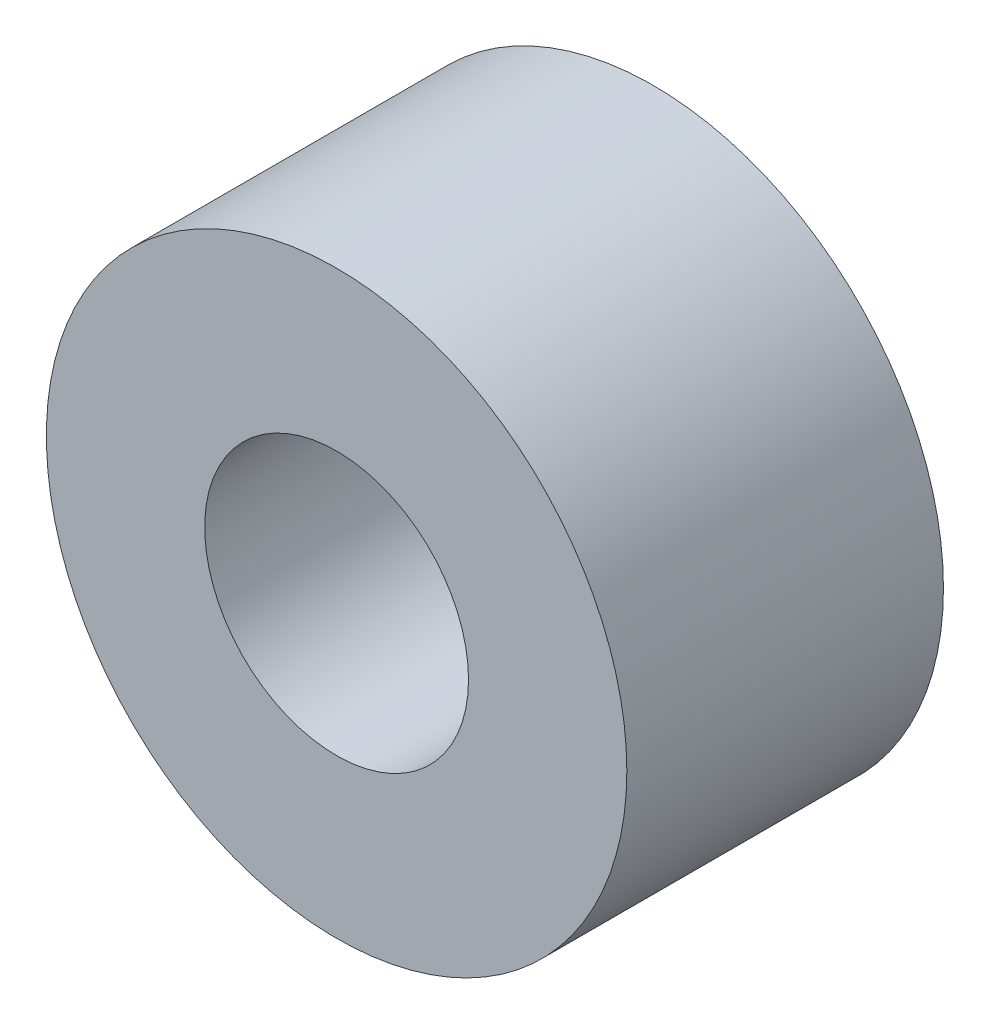
ISO-10303-21;
HEADER;
FILE_DESCRIPTION(('STEP AP214'),'2;1');
FILE_NAME('part.step','',(''),(''),'','','');
FILE_SCHEMA(('AUTOMOTIVE_DESIGN { 1 0 10303 214 1 1 1 1 }'));
ENDSEC;
DATA;
#1=APPLICATION_CONTEXT('core data for automotive mechanical design processes');
#2=APPLICATION_PROTOCOL_DEFINITION('international standard','automotive_design',2000,#1);
#3=PRODUCT_CONTEXT('',#1,'mechanical');
#4=PRODUCT('Part','Part','',(#3));
#5=PRODUCT_RELATED_PRODUCT_CATEGORY('part','',(#4));
#6=PRODUCT_DEFINITION_FORMATION('','',#4);
#7=PRODUCT_DEFINITION_CONTEXT('part definition',#1,'design');
#8=PRODUCT_DEFINITION('design','',#6,#7);
#9=PRODUCT_DEFINITION_SHAPE('','',#8);
#10=(LENGTH_UNIT() NAMED_UNIT(*) SI_UNIT(.MILLI.,.METRE.));
#11=(NAMED_UNIT(*) PLANE_ANGLE_UNIT() SI_UNIT($,.RADIAN.));
#12=(NAMED_UNIT(*) SI_UNIT($,.STERADIAN.) SOLID_ANGLE_UNIT());
#13=UNCERTAINTY_MEASURE_WITH_UNIT(LENGTH_MEASURE(1.E-05),#10,'distance_accuracy_value','');
#14=(GEOMETRIC_REPRESENTATION_CONTEXT(3) GLOBAL_UNCERTAINTY_ASSIGNED_CONTEXT((#13)) GLOBAL_UNIT_ASSIGNED_CONTEXT((#10,
#11,#12)) REPRESENTATION_CONTEXT('',''));
#15=CARTESIAN_POINT('',(0.,0.,0.));
#16=DIRECTION('',(0.,0.,1.));
#17=DIRECTION('',(1.,0.,0.));
#18=AXIS2_PLACEMENT_3D('',#15,#16,#17);
#19=CARTESIAN_POINT('',(0.,0.,6.));
#20=DIRECTION('',(0.,0.,1.));
#21=DIRECTION('',(1.,0.,0.));
#22=AXIS2_PLACEMENT_3D('',#19,#20,#21);
#23=PLANE('',#22);
#24=CARTESIAN_POINT('',(0.,0.,6.));
#25=DIRECTION('',(0.,0.,1.));
#26=DIRECTION('',(1.,0.,0.));
#27=AXIS2_PLACEMENT_3D('',#24,#25,#26);
#28=CIRCLE('',#27,5.5);
#29=CARTESIAN_POINT('',(5.5,0.,6.));
#30=VERTEX_POINT('',#29);
#31=EDGE_CURVE('E10',#30,#30,#28,.T.);
#32=ORIENTED_EDGE('',*,*,#31,.T.);
#33=EDGE_LOOP('',(#32));
#34=FACE_BOUND('',#33,.T.);
#35=CARTESIAN_POINT('',(0.,0.,6.));
#36=DIRECTION('',(0.,0.,1.));
#37=DIRECTION('',(1.,0.,0.));
#38=AXIS2_PLACEMENT_3D('',#35,#36,#37);
#39=CIRCLE('',#38,2.5);
#40=CARTESIAN_POINT('',(2.5,0.,6.));
#41=VERTEX_POINT('',#40);
#42=EDGE_CURVE('E50',#41,#41,#39,.T.);
#43=ORIENTED_EDGE('',*,*,#42,.F.);
#44=EDGE_LOOP('',(#43));
#45=FACE_BOUND('',#44,.T.);
#46=ADVANCED_FACE('F39',(#34,#45),#23,.T.);
#47=CARTESIAN_POINT('',(0.,0.,0.));
#48=DIRECTION('',(0.,0.,1.));
#49=DIRECTION('',(1.,0.,0.));
#50=AXIS2_PLACEMENT_3D('',#47,#48,#49);
#51=PLANE('',#50);
#52=CARTESIAN_POINT('',(0.,0.,0.));
#53=DIRECTION('',(0.,0.,1.));
#54=DIRECTION('',(1.,0.,0.));
#55=AXIS2_PLACEMENT_3D('',#52,#53,#54);
#56=CIRCLE('',#55,5.5);
#57=CARTESIAN_POINT('',(5.5,0.,0.));
#58=VERTEX_POINT('',#57);
#59=EDGE_CURVE('E43',#58,#58,#56,.T.);
#60=ORIENTED_EDGE('',*,*,#59,.F.);
#61=EDGE_LOOP('',(#60));
#62=FACE_BOUND('',#61,.T.);
#63=CARTESIAN_POINT('',(0.,0.,0.));
#64=DIRECTION('',(0.,0.,1.));
#65=DIRECTION('',(1.,0.,0.));
#66=AXIS2_PLACEMENT_3D('',#63,#64,#65);
#67=CIRCLE('',#66,2.5);
#68=CARTESIAN_POINT('',(2.5,0.,0.));
#69=VERTEX_POINT('',#68);
#70=EDGE_CURVE('E52',#69,#69,#67,.T.);
#71=ORIENTED_EDGE('',*,*,#70,.T.);
#72=EDGE_LOOP('',(#71));
#73=FACE_BOUND('',#72,.T.);
#74=ADVANCED_FACE('F62',(#62,#73),#51,.F.);
#75=CARTESIAN_POINT('',(0.,0.,6.));
#76=DIRECTION('',(0.,0.,-1.));
#77=DIRECTION('',(-1.,0.,0.));
#78=AXIS2_PLACEMENT_3D('',#75,#76,#77);
#79=CYLINDRICAL_SURFACE('',#78,5.5);
#80=ORIENTED_EDGE('',*,*,#31,.F.);
#81=EDGE_LOOP('',(#80));
#82=FACE_BOUND('',#81,.T.);
#83=ORIENTED_EDGE('',*,*,#59,.T.);
#84=EDGE_LOOP('',(#83));
#85=FACE_BOUND('',#84,.T.);
#86=ADVANCED_FACE('F41',(#82,#85),#79,.T.);
#87=CARTESIAN_POINT('',(0.,0.,6.));
#88=DIRECTION('',(0.,0.,-1.));
#89=DIRECTION('',(-1.,0.,0.));
#90=AXIS2_PLACEMENT_3D('',#87,#88,#89);
#91=CYLINDRICAL_SURFACE('',#90,2.5);
#92=ORIENTED_EDGE('',*,*,#42,.T.);
#93=EDGE_LOOP('',(#92));
#94=FACE_BOUND('',#93,.T.);
#95=ORIENTED_EDGE('',*,*,#70,.F.);
#96=EDGE_LOOP('',(#95));
#97=FACE_BOUND('',#96,.T.);
#98=ADVANCED_FACE('F58',(#94,#97),#91,.F.);
#99=CLOSED_SHELL('',(#46,#74,#86,#98));
#100=MANIFOLD_SOLID_BREP('B2',#99);
#101=ADVANCED_BREP_SHAPE_REPRESENTATION('',(#18,#100),#14);
#102=SHAPE_DEFINITION_REPRESENTATION(#9,#101);
ENDSEC;
END-ISO-10303-21;
